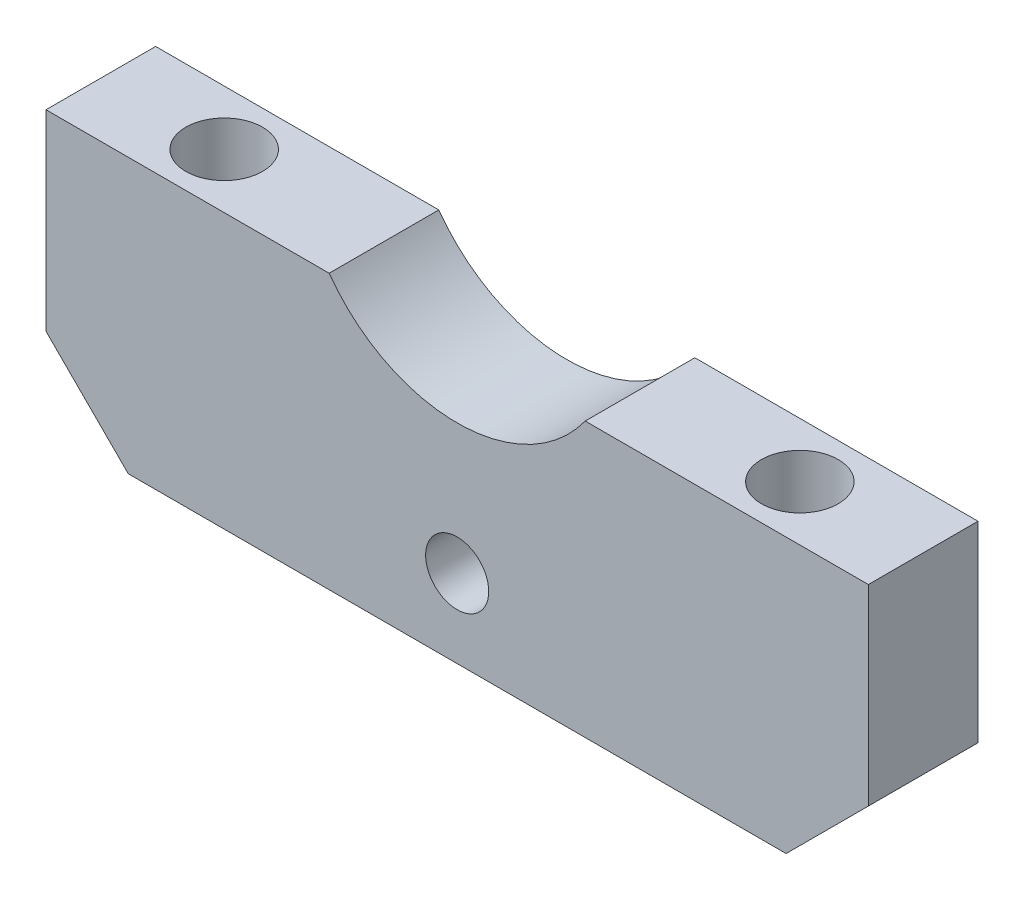
ISO-10303-21;
HEADER;
FILE_DESCRIPTION(('STEP AP214'),'2;1');
FILE_NAME('part.step','',(''),(''),'','','');
FILE_SCHEMA(('AUTOMOTIVE_DESIGN { 1 0 10303 214 1 1 1 1 }'));
ENDSEC;
DATA;
#1=APPLICATION_CONTEXT('core data for automotive mechanical design processes');
#2=APPLICATION_PROTOCOL_DEFINITION('international standard','automotive_design',2000,#1);
#3=PRODUCT_CONTEXT('',#1,'mechanical');
#4=PRODUCT('Part','Part','',(#3));
#5=PRODUCT_RELATED_PRODUCT_CATEGORY('part','',(#4));
#6=PRODUCT_DEFINITION_FORMATION('','',#4);
#7=PRODUCT_DEFINITION_CONTEXT('part definition',#1,'design');
#8=PRODUCT_DEFINITION('design','',#6,#7);
#9=PRODUCT_DEFINITION_SHAPE('','',#8);
#10=(LENGTH_UNIT() NAMED_UNIT(*) SI_UNIT(.MILLI.,.METRE.));
#11=(NAMED_UNIT(*) PLANE_ANGLE_UNIT() SI_UNIT($,.RADIAN.));
#12=(NAMED_UNIT(*) SI_UNIT($,.STERADIAN.) SOLID_ANGLE_UNIT());
#13=UNCERTAINTY_MEASURE_WITH_UNIT(LENGTH_MEASURE(1.E-05),#10,'distance_accuracy_value','');
#14=(GEOMETRIC_REPRESENTATION_CONTEXT(3) GLOBAL_UNCERTAINTY_ASSIGNED_CONTEXT((#13)) GLOBAL_UNIT_ASSIGNED_CONTEXT((#10,
#11,#12)) REPRESENTATION_CONTEXT('',''));
#15=CARTESIAN_POINT('',(0.,0.,0.));
#16=DIRECTION('',(0.,0.,1.));
#17=DIRECTION('',(1.,0.,0.));
#18=AXIS2_PLACEMENT_3D('',#15,#16,#17);
#19=CARTESIAN_POINT('',(-15.,6.5,4.));
#20=DIRECTION('',(0.,-1.,0.));
#21=DIRECTION('',(0.,0.,-1.));
#22=AXIS2_PLACEMENT_3D('',#19,#20,#21);
#23=PLANE('',#22);
#24=CARTESIAN_POINT('',(10.5,6.5,2.));
#25=DIRECTION('',(0.,1.,0.));
#26=DIRECTION('',(0.,0.,-1.));
#27=AXIS2_PLACEMENT_3D('',#24,#25,#26);
#28=CIRCLE('',#27,1.4);
#29=CARTESIAN_POINT('',(10.5,6.5,0.600000000000001));
#30=VERTEX_POINT('',#29);
#31=EDGE_CURVE('E184',#30,#30,#28,.T.);
#32=ORIENTED_EDGE('',*,*,#31,.F.);
#33=EDGE_LOOP('',(#32));
#34=FACE_BOUND('',#33,.T.);
#35=DIRECTION('',(-1.,0.,0.));
#36=VECTOR('',#35,1.);
#37=CARTESIAN_POINT('',(-15.,6.5,0.));
#38=LINE('',#37,#36);
#39=CARTESIAN_POINT('',(15.,6.5,0.));
#40=VERTEX_POINT('',#39);
#41=CARTESIAN_POINT('',(4.67038542306895,6.5,0.));
#42=VERTEX_POINT('',#41);
#43=EDGE_CURVE('E142',#40,#42,#38,.T.);
#44=ORIENTED_EDGE('',*,*,#43,.T.);
#45=DIRECTION('',(0.,0.,1.));
#46=VECTOR('',#45,1.);
#47=CARTESIAN_POINT('',(4.67038542306895,6.5,-6.));
#48=LINE('',#47,#46);
#49=CARTESIAN_POINT('',(4.67038542306895,6.5,4.));
#50=VERTEX_POINT('',#49);
#51=EDGE_CURVE('E114',#42,#50,#48,.T.);
#52=ORIENTED_EDGE('',*,*,#51,.T.);
#53=DIRECTION('',(-1.,0.,0.));
#54=VECTOR('',#53,1.);
#55=CARTESIAN_POINT('',(-15.,6.5,4.));
#56=LINE('',#55,#54);
#57=CARTESIAN_POINT('',(15.,6.5,4.));
#58=VERTEX_POINT('',#57);
#59=EDGE_CURVE('E124',#58,#50,#56,.T.);
#60=ORIENTED_EDGE('',*,*,#59,.F.);
#61=DIRECTION('',(0.,0.,-1.));
#62=VECTOR('',#61,1.);
#63=CARTESIAN_POINT('',(15.,6.5,4.));
#64=LINE('',#63,#62);
#65=EDGE_CURVE('E147',#58,#40,#64,.T.);
#66=ORIENTED_EDGE('',*,*,#65,.T.);
#67=EDGE_LOOP('',(#44,#52,#60,#66));
#68=FACE_BOUND('',#67,.T.);
#69=ADVANCED_FACE('F36',(#34,#68),#23,.F.);
#70=CARTESIAN_POINT('',(15.,-6.5,4.));
#71=DIRECTION('',(-1.,0.,0.));
#72=DIRECTION('',(0.,0.,1.));
#73=AXIS2_PLACEMENT_3D('',#70,#71,#72);
#74=PLANE('',#73);
#75=DIRECTION('',(0.,1.,0.));
#76=VECTOR('',#75,1.);
#77=CARTESIAN_POINT('',(15.,-6.5,4.));
#78=LINE('',#77,#76);
#79=CARTESIAN_POINT('',(15.,-0.499999999999987,4.));
#80=VERTEX_POINT('',#79);
#81=EDGE_CURVE('E131',#80,#58,#78,.T.);
#82=ORIENTED_EDGE('',*,*,#81,.F.);
#83=DIRECTION('',(0.,0.,-1.));
#84=VECTOR('',#83,1.);
#85=CARTESIAN_POINT('',(15.,-0.499999999999987,4.));
#86=LINE('',#85,#84);
#87=CARTESIAN_POINT('',(15.,-0.499999999999987,0.));
#88=VERTEX_POINT('',#87);
#89=EDGE_CURVE('E60',#80,#88,#86,.T.);
#90=ORIENTED_EDGE('',*,*,#89,.T.);
#91=DIRECTION('',(0.,1.,0.));
#92=VECTOR('',#91,1.);
#93=CARTESIAN_POINT('',(15.,-6.5,0.));
#94=LINE('',#93,#92);
#95=EDGE_CURVE('E139',#88,#40,#94,.T.);
#96=ORIENTED_EDGE('',*,*,#95,.T.);
#97=ORIENTED_EDGE('',*,*,#65,.F.);
#98=EDGE_LOOP('',(#82,#90,#96,#97));
#99=FACE_BOUND('',#98,.T.);
#100=ADVANCED_FACE('F176',(#99),#74,.F.);
#101=CARTESIAN_POINT('',(-10.5,6.5,2.));
#102=DIRECTION('',(0.,-1.,0.));
#103=DIRECTION('',(0.,0.,-1.));
#104=AXIS2_PLACEMENT_3D('',#101,#102,#103);
#105=CIRCLE('',#104,1.4);
#106=CARTESIAN_POINT('',(-10.5,6.5,0.600000000000001));
#107=VERTEX_POINT('',#106);
#108=EDGE_CURVE('E180',#107,#107,#105,.T.);
#109=ORIENTED_EDGE('',*,*,#108,.T.);
#110=EDGE_LOOP('',(#109));
#111=FACE_BOUND('',#110,.T.);
#112=CARTESIAN_POINT('',(-4.6703854230661,6.5,4.));
#113=VERTEX_POINT('',#112);
#114=CARTESIAN_POINT('',(-15.,6.5,4.));
#115=VERTEX_POINT('',#114);
#116=EDGE_CURVE('E121',#113,#115,#56,.T.);
#117=ORIENTED_EDGE('',*,*,#116,.F.);
#118=DIRECTION('',(0.,0.,1.));
#119=VECTOR('',#118,1.);
#120=CARTESIAN_POINT('',(-4.6703854230661,6.5,-6.));
#121=LINE('',#120,#119);
#122=CARTESIAN_POINT('',(-4.6703854230661,6.5,0.));
#123=VERTEX_POINT('',#122);
#124=EDGE_CURVE('E104',#113,#123,#121,.F.);
#125=ORIENTED_EDGE('',*,*,#124,.T.);
#126=CARTESIAN_POINT('',(-15.,6.5,0.));
#127=VERTEX_POINT('',#126);
#128=EDGE_CURVE('E141',#123,#127,#38,.T.);
#129=ORIENTED_EDGE('',*,*,#128,.T.);
#130=DIRECTION('',(0.,0.,-1.));
#131=VECTOR('',#130,1.);
#132=CARTESIAN_POINT('',(-15.,6.5,4.));
#133=LINE('',#132,#131);
#134=EDGE_CURVE('E129',#115,#127,#133,.T.);
#135=ORIENTED_EDGE('',*,*,#134,.F.);
#136=EDGE_LOOP('',(#117,#125,#129,#135));
#137=FACE_BOUND('',#136,.T.);
#138=ADVANCED_FACE('F127',(#111,#137),#23,.F.);
#139=CARTESIAN_POINT('',(-15.,-6.5,4.));
#140=DIRECTION('',(1.,0.,0.));
#141=DIRECTION('',(0.,0.,-1.));
#142=AXIS2_PLACEMENT_3D('',#139,#140,#141);
#143=PLANE('',#142);
#144=DIRECTION('',(0.,-1.,0.));
#145=VECTOR('',#144,1.);
#146=CARTESIAN_POINT('',(-15.,-6.5,0.));
#147=LINE('',#146,#145);
#148=CARTESIAN_POINT('',(-15.,-0.500000000000003,0.));
#149=VERTEX_POINT('',#148);
#150=EDGE_CURVE('E134',#127,#149,#147,.T.);
#151=ORIENTED_EDGE('',*,*,#150,.T.);
#152=DIRECTION('',(0.,0.,1.));
#153=VECTOR('',#152,1.);
#154=CARTESIAN_POINT('',(-15.,-0.500000000000001,4.));
#155=LINE('',#154,#153);
#156=CARTESIAN_POINT('',(-15.,-0.500000000000003,4.));
#157=VERTEX_POINT('',#156);
#158=EDGE_CURVE('E11',#149,#157,#155,.T.);
#159=ORIENTED_EDGE('',*,*,#158,.T.);
#160=DIRECTION('',(0.,-1.,0.));
#161=VECTOR('',#160,1.);
#162=CARTESIAN_POINT('',(-15.,-6.5,4.));
#163=LINE('',#162,#161);
#164=EDGE_CURVE('E133',#115,#157,#163,.T.);
#165=ORIENTED_EDGE('',*,*,#164,.F.);
#166=ORIENTED_EDGE('',*,*,#134,.T.);
#167=EDGE_LOOP('',(#151,#159,#165,#166));
#168=FACE_BOUND('',#167,.T.);
#169=ADVANCED_FACE('F208',(#168),#143,.F.);
#170=CARTESIAN_POINT('',(0.,0.,4.));
#171=DIRECTION('',(0.,0.,-1.));
#172=DIRECTION('',(-1.,0.,0.));
#173=AXIS2_PLACEMENT_3D('',#170,#171,#172);
#174=PLANE('',#173);
#175=CARTESIAN_POINT('',(0.,-0.645898033750416,4.));
#176=DIRECTION('',(0.,0.,1.));
#177=DIRECTION('',(1.,0.,0.));
#178=AXIS2_PLACEMENT_3D('',#175,#176,#177);
#179=CIRCLE('',#178,1.15);
#180=CARTESIAN_POINT('',(1.15,-0.645898033750416,4.));
#181=VERTEX_POINT('',#180);
#182=EDGE_CURVE('E192',#181,#181,#179,.T.);
#183=ORIENTED_EDGE('',*,*,#182,.F.);
#184=EDGE_LOOP('',(#183));
#185=FACE_BOUND('',#184,.T.);
#186=DIRECTION('',(-1.,0.,0.));
#187=VECTOR('',#186,1.);
#188=CARTESIAN_POINT('',(-15.,-3.5,4.));
#189=LINE('',#188,#187);
#190=CARTESIAN_POINT('',(12.,-3.5,4.));
#191=VERTEX_POINT('',#190);
#192=CARTESIAN_POINT('',(-12.,-3.5,4.));
#193=VERTEX_POINT('',#192);
#194=EDGE_CURVE('E125',#191,#193,#189,.T.);
#195=ORIENTED_EDGE('',*,*,#194,.F.);
#196=DIRECTION('',(-0.707106781186547,-0.707106781186548,0.));
#197=VECTOR('',#196,1.);
#198=CARTESIAN_POINT('',(12.,-3.5,4.));
#199=LINE('',#198,#197);
#200=EDGE_CURVE('E161',#191,#80,#199,.F.);
#201=ORIENTED_EDGE('',*,*,#200,.T.);
#202=ORIENTED_EDGE('',*,*,#81,.T.);
#203=ORIENTED_EDGE('',*,*,#59,.T.);
#204=CARTESIAN_POINT('',(1.42594269725294E-12,9.85410196624944,4.));
#205=DIRECTION('',(0.,0.,1.));
#206=DIRECTION('',(1.,0.,0.));
#207=AXIS2_PLACEMENT_3D('',#204,#205,#206);
#208=CIRCLE('',#207,5.75);
#209=EDGE_CURVE('E107',#113,#50,#208,.T.);
#210=ORIENTED_EDGE('',*,*,#209,.F.);
#211=ORIENTED_EDGE('',*,*,#116,.T.);
#212=ORIENTED_EDGE('',*,*,#164,.T.);
#213=DIRECTION('',(-0.707106781186549,0.707106781186546,0.));
#214=VECTOR('',#213,1.);
#215=CARTESIAN_POINT('',(-15.,-0.500000000000001,4.));
#216=LINE('',#215,#214);
#217=EDGE_CURVE('E159',#157,#193,#216,.F.);
#218=ORIENTED_EDGE('',*,*,#217,.T.);
#219=EDGE_LOOP('',(#195,#201,#202,#203,#210,#211,#212,#218));
#220=FACE_BOUND('',#219,.T.);
#221=ADVANCED_FACE('F119',(#185,#220),#174,.F.);
#222=CARTESIAN_POINT('',(0.,0.,0.));
#223=DIRECTION('',(0.,0.,-1.));
#224=DIRECTION('',(-1.,0.,0.));
#225=AXIS2_PLACEMENT_3D('',#222,#223,#224);
#226=PLANE('',#225);
#227=CARTESIAN_POINT('',(0.,-0.645898033750416,0.));
#228=DIRECTION('',(0.,0.,-1.));
#229=DIRECTION('',(-1.,0.,0.));
#230=AXIS2_PLACEMENT_3D('',#227,#228,#229);
#231=CIRCLE('',#230,1.15);
#232=CARTESIAN_POINT('',(-1.15,-0.645898033750416,0.));
#233=VERTEX_POINT('',#232);
#234=EDGE_CURVE('E40',#233,#233,#231,.T.);
#235=ORIENTED_EDGE('',*,*,#234,.F.);
#236=EDGE_LOOP('',(#235));
#237=FACE_BOUND('',#236,.T.);
#238=ORIENTED_EDGE('',*,*,#95,.F.);
#239=DIRECTION('',(0.707106781186547,0.707106781186548,0.));
#240=VECTOR('',#239,1.);
#241=CARTESIAN_POINT('',(7.75000000000001,-7.74999999999999,0.));
#242=LINE('',#241,#240);
#243=CARTESIAN_POINT('',(12.,-3.5,0.));
#244=VERTEX_POINT('',#243);
#245=EDGE_CURVE('E45',#88,#244,#242,.F.);
#246=ORIENTED_EDGE('',*,*,#245,.T.);
#247=DIRECTION('',(1.,0.,0.));
#248=VECTOR('',#247,1.);
#249=CARTESIAN_POINT('',(0.,-3.5,0.));
#250=LINE('',#249,#248);
#251=CARTESIAN_POINT('',(-12.,-3.5,0.));
#252=VERTEX_POINT('',#251);
#253=EDGE_CURVE('E151',#252,#244,#250,.T.);
#254=ORIENTED_EDGE('',*,*,#253,.F.);
#255=DIRECTION('',(0.707106781186549,-0.707106781186546,0.));
#256=VECTOR('',#255,1.);
#257=CARTESIAN_POINT('',(-7.74999999999998,-7.75,0.));
#258=LINE('',#257,#256);
#259=EDGE_CURVE('E52',#252,#149,#258,.F.);
#260=ORIENTED_EDGE('',*,*,#259,.T.);
#261=ORIENTED_EDGE('',*,*,#150,.F.);
#262=ORIENTED_EDGE('',*,*,#128,.F.);
#263=CARTESIAN_POINT('',(1.42594269725294E-12,9.85410196624944,0.));
#264=DIRECTION('',(0.,0.,-1.));
#265=DIRECTION('',(-1.,0.,0.));
#266=AXIS2_PLACEMENT_3D('',#263,#264,#265);
#267=CIRCLE('',#266,5.75);
#268=EDGE_CURVE('E110',#42,#123,#267,.T.);
#269=ORIENTED_EDGE('',*,*,#268,.F.);
#270=ORIENTED_EDGE('',*,*,#43,.F.);
#271=EDGE_LOOP('',(#238,#246,#254,#260,#261,#262,#269,#270));
#272=FACE_BOUND('',#271,.T.);
#273=ADVANCED_FACE('F166',(#237,#272),#226,.T.);
#274=CARTESIAN_POINT('',(1.42594269725294E-12,9.85410196624944,-6.));
#275=DIRECTION('',(0.,0.,1.));
#276=DIRECTION('',(1.,0.,0.));
#277=AXIS2_PLACEMENT_3D('',#274,#275,#276);
#278=CYLINDRICAL_SURFACE('',#277,5.75);
#279=ORIENTED_EDGE('',*,*,#268,.T.);
#280=ORIENTED_EDGE('',*,*,#124,.F.);
#281=ORIENTED_EDGE('',*,*,#209,.T.);
#282=ORIENTED_EDGE('',*,*,#51,.F.);
#283=EDGE_LOOP('',(#279,#280,#281,#282));
#284=FACE_BOUND('',#283,.T.);
#285=ADVANCED_FACE('F106',(#284),#278,.F.);
#286=CARTESIAN_POINT('',(-15.,-3.5,-6.));
#287=DIRECTION('',(0.,1.,0.));
#288=DIRECTION('',(0.,0.,1.));
#289=AXIS2_PLACEMENT_3D('',#286,#287,#288);
#290=PLANE('',#289);
#291=CARTESIAN_POINT('',(10.5,-3.5,2.));
#292=DIRECTION('',(0.,1.,0.));
#293=DIRECTION('',(0.,0.,-1.));
#294=AXIS2_PLACEMENT_3D('',#291,#292,#293);
#295=CIRCLE('',#294,1.4);
#296=CARTESIAN_POINT('',(10.5,-3.5,0.600000000000001));
#297=VERTEX_POINT('',#296);
#298=EDGE_CURVE('E187',#297,#297,#295,.T.);
#299=ORIENTED_EDGE('',*,*,#298,.T.);
#300=EDGE_LOOP('',(#299));
#301=FACE_BOUND('',#300,.T.);
#302=CARTESIAN_POINT('',(-10.5,-3.5,2.));
#303=DIRECTION('',(0.,-1.,0.));
#304=DIRECTION('',(0.,0.,-1.));
#305=AXIS2_PLACEMENT_3D('',#302,#303,#304);
#306=CIRCLE('',#305,1.4);
#307=CARTESIAN_POINT('',(-10.5,-3.5,0.600000000000001));
#308=VERTEX_POINT('',#307);
#309=EDGE_CURVE('E181',#308,#308,#306,.T.);
#310=ORIENTED_EDGE('',*,*,#309,.F.);
#311=EDGE_LOOP('',(#310));
#312=FACE_BOUND('',#311,.T.);
#313=ORIENTED_EDGE('',*,*,#253,.T.);
#314=DIRECTION('',(0.,0.,1.));
#315=VECTOR('',#314,1.);
#316=CARTESIAN_POINT('',(12.,-3.5,-6.));
#317=LINE('',#316,#315);
#318=EDGE_CURVE('E156',#244,#191,#317,.T.);
#319=ORIENTED_EDGE('',*,*,#318,.T.);
#320=ORIENTED_EDGE('',*,*,#194,.T.);
#321=DIRECTION('',(0.,0.,-1.));
#322=VECTOR('',#321,1.);
#323=CARTESIAN_POINT('',(-12.,-3.5,-6.));
#324=LINE('',#323,#322);
#325=EDGE_CURVE('E154',#193,#252,#324,.T.);
#326=ORIENTED_EDGE('',*,*,#325,.T.);
#327=EDGE_LOOP('',(#313,#319,#320,#326));
#328=FACE_BOUND('',#327,.T.);
#329=ADVANCED_FACE('F171',(#301,#312,#328),#290,.F.);
#330=CARTESIAN_POINT('',(12.,-3.5,-6.));
#331=DIRECTION('',(-0.707106781186548,0.707106781186547,0.));
#332=DIRECTION('',(0.,0.,1.));
#333=AXIS2_PLACEMENT_3D('',#330,#331,#332);
#334=PLANE('',#333);
#335=ORIENTED_EDGE('',*,*,#245,.F.);
#336=ORIENTED_EDGE('',*,*,#89,.F.);
#337=ORIENTED_EDGE('',*,*,#200,.F.);
#338=ORIENTED_EDGE('',*,*,#318,.F.);
#339=EDGE_LOOP('',(#335,#336,#337,#338));
#340=FACE_BOUND('',#339,.T.);
#341=ADVANCED_FACE('F174',(#340),#334,.F.);
#342=CARTESIAN_POINT('',(-15.,-0.500000000000001,4.));
#343=DIRECTION('',(0.707106781186546,0.707106781186549,0.));
#344=DIRECTION('',(0.,0.,1.));
#345=AXIS2_PLACEMENT_3D('',#342,#343,#344);
#346=PLANE('',#345);
#347=ORIENTED_EDGE('',*,*,#259,.F.);
#348=ORIENTED_EDGE('',*,*,#325,.F.);
#349=ORIENTED_EDGE('',*,*,#217,.F.);
#350=ORIENTED_EDGE('',*,*,#158,.F.);
#351=EDGE_LOOP('',(#347,#348,#349,#350));
#352=FACE_BOUND('',#351,.T.);
#353=ADVANCED_FACE('F38',(#352),#346,.F.);
#354=CARTESIAN_POINT('',(-10.5,6.5,2.));
#355=DIRECTION('',(0.,-1.,0.));
#356=DIRECTION('',(0.,0.,-1.));
#357=AXIS2_PLACEMENT_3D('',#354,#355,#356);
#358=CYLINDRICAL_SURFACE('',#357,1.4);
#359=ORIENTED_EDGE('',*,*,#108,.F.);
#360=EDGE_LOOP('',(#359));
#361=FACE_BOUND('',#360,.T.);
#362=ORIENTED_EDGE('',*,*,#309,.T.);
#363=EDGE_LOOP('',(#362));
#364=FACE_BOUND('',#363,.T.);
#365=ADVANCED_FACE('F228',(#361,#364),#358,.F.);
#366=CARTESIAN_POINT('',(10.5,6.5,2.));
#367=DIRECTION('',(0.,-1.,0.));
#368=DIRECTION('',(0.,0.,-1.));
#369=AXIS2_PLACEMENT_3D('',#366,#367,#368);
#370=CYLINDRICAL_SURFACE('',#369,1.4);
#371=ORIENTED_EDGE('',*,*,#31,.T.);
#372=EDGE_LOOP('',(#371));
#373=FACE_BOUND('',#372,.T.);
#374=ORIENTED_EDGE('',*,*,#298,.F.);
#375=EDGE_LOOP('',(#374));
#376=FACE_BOUND('',#375,.T.);
#377=ADVANCED_FACE('F231',(#373,#376),#370,.F.);
#378=CARTESIAN_POINT('',(0.,-0.645898033750416,-6.));
#379=DIRECTION('',(0.,0.,1.));
#380=DIRECTION('',(1.,0.,0.));
#381=AXIS2_PLACEMENT_3D('',#378,#379,#380);
#382=CYLINDRICAL_SURFACE('',#381,1.15);
#383=ORIENTED_EDGE('',*,*,#234,.T.);
#384=EDGE_LOOP('',(#383));
#385=FACE_BOUND('',#384,.T.);
#386=ORIENTED_EDGE('',*,*,#182,.T.);
#387=EDGE_LOOP('',(#386));
#388=FACE_BOUND('',#387,.T.);
#389=ADVANCED_FACE('F199',(#385,#388),#382,.F.);
#390=CLOSED_SHELL('',(#69,#100,#138,#169,#221,#273,#285,#329,#341,#353,#365,#377,#389));
#391=MANIFOLD_SOLID_BREP('B2',#390);
#392=ADVANCED_BREP_SHAPE_REPRESENTATION('',(#18,#391),#14);
#393=SHAPE_DEFINITION_REPRESENTATION(#9,#392);
ENDSEC;
END-ISO-10303-21;
